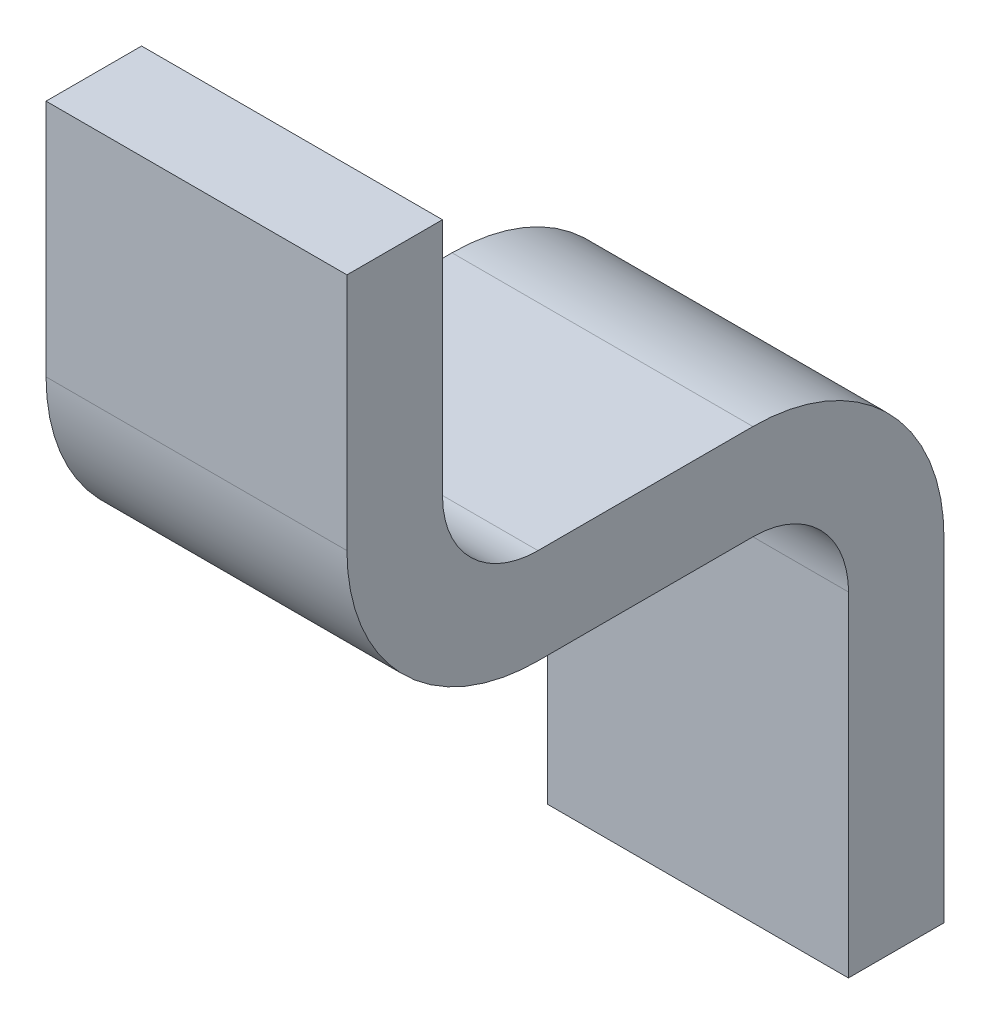
ISO-10303-21;
HEADER;
FILE_DESCRIPTION(('STEP AP214'),'2;1');
FILE_NAME('part.step','',(''),(''),'','','');
FILE_SCHEMA(('AUTOMOTIVE_DESIGN { 1 0 10303 214 1 1 1 1 }'));
ENDSEC;
DATA;
#1=APPLICATION_CONTEXT('core data for automotive mechanical design processes');
#2=APPLICATION_PROTOCOL_DEFINITION('international standard','automotive_design',2000,#1);
#3=PRODUCT_CONTEXT('',#1,'mechanical');
#4=PRODUCT('Part','Part','',(#3));
#5=PRODUCT_RELATED_PRODUCT_CATEGORY('part','',(#4));
#6=PRODUCT_DEFINITION_FORMATION('','',#4);
#7=PRODUCT_DEFINITION_CONTEXT('part definition',#1,'design');
#8=PRODUCT_DEFINITION('design','',#6,#7);
#9=PRODUCT_DEFINITION_SHAPE('','',#8);
#10=(LENGTH_UNIT() NAMED_UNIT(*) SI_UNIT(.MILLI.,.METRE.));
#11=(NAMED_UNIT(*) PLANE_ANGLE_UNIT() SI_UNIT($,.RADIAN.));
#12=(NAMED_UNIT(*) SI_UNIT($,.STERADIAN.) SOLID_ANGLE_UNIT());
#13=UNCERTAINTY_MEASURE_WITH_UNIT(LENGTH_MEASURE(1.E-05),#10,'distance_accuracy_value','');
#14=(GEOMETRIC_REPRESENTATION_CONTEXT(3) GLOBAL_UNCERTAINTY_ASSIGNED_CONTEXT((#13)) GLOBAL_UNIT_ASSIGNED_CONTEXT((#10,
#11,#12)) REPRESENTATION_CONTEXT('',''));
#15=CARTESIAN_POINT('',(0.,0.,0.));
#16=DIRECTION('',(0.,0.,1.));
#17=DIRECTION('',(1.,0.,0.));
#18=AXIS2_PLACEMENT_3D('',#15,#16,#17);
#19=CARTESIAN_POINT('',(-30.9980003715393,-4.22982485487725,2.68531594000001));
#20=CARTESIAN_POINT('',(-31.3760003715394,-4.22982487140016,2.68531594000001));
#21=CARTESIAN_POINT('',(-30.9980003715393,-4.22982485487725,2.56531594000001));
#22=CARTESIAN_POINT('',(-31.3760003715394,-4.22982487140016,2.56531594000001));
#23=(BOUNDED_SURFACE() B_SPLINE_SURFACE(1,1,((#19,#20),(#21,#22)),.UNSPECIFIED.,.F.,.F.,
.F.) B_SPLINE_SURFACE_WITH_KNOTS((2,2),(2,2),(-0.00011,1.E-05),(-0.000346500000000114,
3.15000000000103E-05),
.UNSPECIFIED.) GEOMETRIC_REPRESENTATION_ITEM() RATIONAL_B_SPLINE_SURFACE(((1.,1.),(1.,1.))) REPRESENTATION_ITEM('') SURFACE());
#24=CARTESIAN_POINT('',(-31.3445003715394,-4.22982487002325,2.57531594000001));
#25=CARTESIAN_POINT('',(-31.3445003715394,-4.22982487002325,2.67531594000001));
#26=(BOUNDED_CURVE() B_SPLINE_CURVE(1,(#24,#25),.UNSPECIFIED.,.F.,
.F.) B_SPLINE_CURVE_WITH_KNOTS((2,2),(-0.0001,0.),
.UNSPECIFIED.) CURVE() GEOMETRIC_REPRESENTATION_ITEM() RATIONAL_B_SPLINE_CURVE((1.,1.)) REPRESENTATION_ITEM(''));
#27=CARTESIAN_POINT('',(-31.3445003715394,-4.22982487002325,2.57531594000001));
#28=VERTEX_POINT('',#27);
#29=CARTESIAN_POINT('',(-31.3445003715394,-4.22982487002325,2.67531594000001));
#30=VERTEX_POINT('',#29);
#31=EDGE_CURVE('E181',#28,#30,#26,.T.);
#32=CARTESIAN_POINT('',(-31.3445003715394,-4.22982487002325,2.67531594000001));
#33=CARTESIAN_POINT('',(-31.0295003715393,-4.22982485625416,2.67531594000001));
#34=(BOUNDED_CURVE() B_SPLINE_CURVE(1,(#32,#33),.UNSPECIFIED.,.F.,
.F.) B_SPLINE_CURVE_WITH_KNOTS((2,2),(-0.000315000000000101,0.),
.UNSPECIFIED.) CURVE() GEOMETRIC_REPRESENTATION_ITEM() RATIONAL_B_SPLINE_CURVE((1.,1.)) REPRESENTATION_ITEM(''));
#35=CARTESIAN_POINT('',(-31.0295003715393,-4.22982485625416,2.67531594000001));
#36=VERTEX_POINT('',#35);
#37=EDGE_CURVE('E207',#30,#36,#34,.T.);
#38=CARTESIAN_POINT('',(-31.0295003715393,-4.22982485625416,2.67531594000001));
#39=CARTESIAN_POINT('',(-31.0295003715393,-4.22982485625416,2.57531594000001));
#40=(BOUNDED_CURVE() B_SPLINE_CURVE(1,(#38,#39),.UNSPECIFIED.,.F.,
.F.) B_SPLINE_CURVE_WITH_KNOTS((2,2),(-0.0001,0.),
.UNSPECIFIED.) CURVE() GEOMETRIC_REPRESENTATION_ITEM() RATIONAL_B_SPLINE_CURVE((1.,1.)) REPRESENTATION_ITEM(''));
#41=CARTESIAN_POINT('',(-31.0295003715393,-4.22982485625416,2.57531594000001));
#42=VERTEX_POINT('',#41);
#43=EDGE_CURVE('E249',#36,#42,#40,.T.);
#44=CARTESIAN_POINT('',(-31.0295003715393,-4.22982485625416,2.57531594000001));
#45=CARTESIAN_POINT('',(-31.3445003715394,-4.22982487002325,2.57531594000001));
#46=(BOUNDED_CURVE() B_SPLINE_CURVE(1,(#44,#45),.UNSPECIFIED.,.F.,
.F.) B_SPLINE_CURVE_WITH_KNOTS((2,2),(-0.000315000000000101,0.),
.UNSPECIFIED.) CURVE() GEOMETRIC_REPRESENTATION_ITEM() RATIONAL_B_SPLINE_CURVE((1.,1.)) REPRESENTATION_ITEM(''));
#47=EDGE_CURVE('E11',#42,#28,#46,.T.);
#48=ORIENTED_EDGE('',*,*,#31,.T.);
#49=ORIENTED_EDGE('',*,*,#37,.T.);
#50=ORIENTED_EDGE('',*,*,#43,.T.);
#51=ORIENTED_EDGE('',*,*,#47,.T.);
#52=EDGE_LOOP('',(#48,#49,#50,#51));
#53=FACE_BOUND('',#52,.T.);
#54=ADVANCED_FACE('F17',(#53),#23,.T.);
#55=CARTESIAN_POINT('',(-31.3760003726322,-4.20482487140015,2.57531594000001));
#56=CARTESIAN_POINT('',(-31.3760003595188,-4.50482487140017,2.57531594000001));
#57=CARTESIAN_POINT('',(-30.9980003726321,-4.20482485487725,2.57531594000001));
#58=CARTESIAN_POINT('',(-30.9980003595187,-4.50482485487727,2.57531594000001));
#59=(BOUNDED_SURFACE() B_SPLINE_SURFACE(1,1,((#55,#56),(#57,#58)),.UNSPECIFIED.,.F.,.F.,
.F.) B_SPLINE_SURFACE_WITH_KNOTS((2,2),(2,2),(-0.000346500000000112,3.15000000000177E-05),
(-2.50000000000049E-05,0.000275000000000012),
.UNSPECIFIED.) GEOMETRIC_REPRESENTATION_ITEM() RATIONAL_B_SPLINE_SURFACE(((1.,1.),(1.,1.))) REPRESENTATION_ITEM('') SURFACE());
#60=CARTESIAN_POINT('',(-31.0295003606115,-4.47982485625417,2.57531594000001));
#61=CARTESIAN_POINT('',(-31.3445003606115,-4.47982487002326,2.57531594000001));
#62=(BOUNDED_CURVE() B_SPLINE_CURVE(1,(#60,#61),.UNSPECIFIED.,.F.,
.F.) B_SPLINE_CURVE_WITH_KNOTS((2,2),(-0.000315,0.),
.UNSPECIFIED.) CURVE() GEOMETRIC_REPRESENTATION_ITEM() RATIONAL_B_SPLINE_CURVE((1.,1.)) REPRESENTATION_ITEM(''));
#63=CARTESIAN_POINT('',(-31.0295003606115,-4.47982485625416,2.57531594000001));
#64=VERTEX_POINT('',#63);
#65=CARTESIAN_POINT('',(-31.3445003606115,-4.47982487002326,2.57531594000001));
#66=VERTEX_POINT('',#65);
#67=EDGE_CURVE('E32',#64,#66,#62,.T.);
#68=CARTESIAN_POINT('',(-31.3445003715394,-4.22982487002325,2.57531594000001));
#69=CARTESIAN_POINT('',(-31.3445003606116,-4.47982487002326,2.57531594000001));
#70=(BOUNDED_CURVE() B_SPLINE_CURVE(1,(#68,#69),.UNSPECIFIED.,.F.,
.F.) B_SPLINE_CURVE_WITH_KNOTS((2,2),(0.,0.00025000000000001),
.UNSPECIFIED.) CURVE() GEOMETRIC_REPRESENTATION_ITEM() RATIONAL_B_SPLINE_CURVE((1.,1.)) REPRESENTATION_ITEM(''));
#71=EDGE_CURVE('E269',#28,#66,#70,.T.);
#72=CARTESIAN_POINT('',(-31.0295003715393,-4.22982485625416,2.57531594000001));
#73=CARTESIAN_POINT('',(-31.0295003606115,-4.47982485625416,2.57531594000001));
#74=(BOUNDED_CURVE() B_SPLINE_CURVE(1,(#72,#73),.UNSPECIFIED.,.F.,
.F.) B_SPLINE_CURVE_WITH_KNOTS((2,2),(0.,0.00025),
.UNSPECIFIED.) CURVE() GEOMETRIC_REPRESENTATION_ITEM() RATIONAL_B_SPLINE_CURVE((1.,1.)) REPRESENTATION_ITEM(''));
#75=EDGE_CURVE('E240',#42,#64,#74,.T.);
#76=ORIENTED_EDGE('',*,*,#67,.T.);
#77=ORIENTED_EDGE('',*,*,#71,.F.);
#78=ORIENTED_EDGE('',*,*,#47,.F.);
#79=ORIENTED_EDGE('',*,*,#75,.T.);
#80=EDGE_LOOP('',(#76,#77,#78,#79));
#81=FACE_BOUND('',#80,.T.);
#82=ADVANCED_FACE('F395',(#81),#59,.T.);
#83=CARTESIAN_POINT('',(-31.3445003606115,-4.47982487002326,2.57531594000001));
#84=CARTESIAN_POINT('',(-31.3445003562404,-4.57982487002326,2.57531594000001));
#85=CARTESIAN_POINT('',(-31.3445003562404,-4.57982487002326,2.47531594000001));
#86=CARTESIAN_POINT('',(-31.0295003606114,-4.47982485625417,2.57531594000001));
#87=CARTESIAN_POINT('',(-31.0295003562403,-4.57982485625417,2.57531594000001));
#88=CARTESIAN_POINT('',(-31.0295003562403,-4.57982485625417,2.47531594000001));
#89=(BOUNDED_SURFACE() B_SPLINE_SURFACE(1,2,((#83,#84,#85),(#86,#87,#88)),.UNSPECIFIED.,.F.,.F.,
.F.) B_SPLINE_SURFACE_WITH_KNOTS((2,2),(3,3),(-3.9778146934052E-13,3.15000000000066),
(-3.14159265358979,-1.5707963267949),
.UNSPECIFIED.) GEOMETRIC_REPRESENTATION_ITEM() RATIONAL_B_SPLINE_SURFACE(((1.,0.707106781186548,
1.),(1.,0.707106781186548,1.))) REPRESENTATION_ITEM('') SURFACE());
#90=CARTESIAN_POINT('',(-31.3445003562404,-4.57982487002324,2.47531594000001));
#91=CARTESIAN_POINT('',(-31.0295003562403,-4.57982485625415,2.47531594000001));
#92=(BOUNDED_CURVE() B_SPLINE_CURVE(1,(#90,#91),.UNSPECIFIED.,.F.,
.F.) B_SPLINE_CURVE_WITH_KNOTS((2,2),(0.,0.000315000000000105),
.UNSPECIFIED.) CURVE() GEOMETRIC_REPRESENTATION_ITEM() RATIONAL_B_SPLINE_CURVE((1.,1.)) REPRESENTATION_ITEM(''));
#93=CARTESIAN_POINT('',(-31.3445003562404,-4.57982487002324,2.47531594000001));
#94=VERTEX_POINT('',#93);
#95=CARTESIAN_POINT('',(-31.0295003562403,-4.57982485625416,2.47531594000001));
#96=VERTEX_POINT('',#95);
#97=EDGE_CURVE('E180',#94,#96,#92,.T.);
#98=CARTESIAN_POINT('',(-31.3445003606115,-4.47982487002326,2.57531594000001));
#99=CARTESIAN_POINT('',(-31.3445003562404,-4.57982487002326,2.57531594000001));
#100=CARTESIAN_POINT('',(-31.3445003562404,-4.57982487002326,2.47531594000001));
#101=(BOUNDED_CURVE() B_SPLINE_CURVE(2,(#98,#99,#100),.UNSPECIFIED.,.F.,
.F.) B_SPLINE_CURVE_WITH_KNOTS((3,3),(0.,1.5707963267949),
.UNSPECIFIED.) CURVE() GEOMETRIC_REPRESENTATION_ITEM() RATIONAL_B_SPLINE_CURVE((1.,
0.707106781186529,1.)) REPRESENTATION_ITEM(''));
#102=EDGE_CURVE('E259',#66,#94,#101,.T.);
#103=CARTESIAN_POINT('',(-31.0295003606115,-4.47982485625416,2.57531594000001));
#104=CARTESIAN_POINT('',(-31.0295003562404,-4.57982485625416,2.57531594000001));
#105=CARTESIAN_POINT('',(-31.0295003562404,-4.57982485625416,2.47531594000001));
#106=(BOUNDED_CURVE() B_SPLINE_CURVE(2,(#103,#104,#105),.UNSPECIFIED.,.F.,
.F.) B_SPLINE_CURVE_WITH_KNOTS((3,3),(-3.14159265358979,-1.5707963267949),
.UNSPECIFIED.) CURVE() GEOMETRIC_REPRESENTATION_ITEM() RATIONAL_B_SPLINE_CURVE((1.,
0.707106781186529,1.)) REPRESENTATION_ITEM(''));
#107=EDGE_CURVE('E250',#64,#96,#106,.T.);
#108=ORIENTED_EDGE('',*,*,#97,.F.);
#109=ORIENTED_EDGE('',*,*,#102,.F.);
#110=ORIENTED_EDGE('',*,*,#67,.F.);
#111=ORIENTED_EDGE('',*,*,#107,.T.);
#112=EDGE_LOOP('',(#108,#109,#110,#111));
#113=FACE_BOUND('',#112,.T.);
#114=ADVANCED_FACE('F389',(#113),#89,.T.);
#115=CARTESIAN_POINT('',(-31.3760003562404,-4.57982487140015,2.49781594000001));
#116=CARTESIAN_POINT('',(-31.3760003562404,-4.57982487140015,2.22781594000001));
#117=CARTESIAN_POINT('',(-30.9980003562403,-4.57982485487724,2.49781594000001));
#118=CARTESIAN_POINT('',(-30.9980003562403,-4.57982485487724,2.22781594000001));
#119=(BOUNDED_SURFACE() B_SPLINE_SURFACE(1,1,((#115,#116),(#117,#118)),.UNSPECIFIED.,.F.,.F.,
.F.) B_SPLINE_SURFACE_WITH_KNOTS((2,2),(2,2),(-0.000346500000000118,3.15000000000107E-05),
(-2.25E-05,0.0002475),
.UNSPECIFIED.) GEOMETRIC_REPRESENTATION_ITEM() RATIONAL_B_SPLINE_SURFACE(((1.,1.),(1.,1.))) REPRESENTATION_ITEM('') SURFACE());
#120=CARTESIAN_POINT('',(-31.0295003562403,-4.57982485625415,2.25031594000001));
#121=CARTESIAN_POINT('',(-31.3445003562404,-4.57982487002324,2.25031594000001));
#122=(BOUNDED_CURVE() B_SPLINE_CURVE(1,(#120,#121),.UNSPECIFIED.,.F.,
.F.) B_SPLINE_CURVE_WITH_KNOTS((2,2),(-0.000315000000000105,0.),
.UNSPECIFIED.) CURVE() GEOMETRIC_REPRESENTATION_ITEM() RATIONAL_B_SPLINE_CURVE((1.,1.)) REPRESENTATION_ITEM(''));
#123=CARTESIAN_POINT('',(-31.0295003562403,-4.57982485625416,2.25031594000001));
#124=VERTEX_POINT('',#123);
#125=CARTESIAN_POINT('',(-31.3445003562404,-4.57982487002324,2.25031594000001));
#126=VERTEX_POINT('',#125);
#127=EDGE_CURVE('E172',#124,#126,#122,.T.);
#128=CARTESIAN_POINT('',(-31.3445003562404,-4.57982487002324,2.47531594000001));
#129=CARTESIAN_POINT('',(-31.3445003562404,-4.57982487002324,2.25031594000001));
#130=(BOUNDED_CURVE() B_SPLINE_CURVE(1,(#128,#129),.UNSPECIFIED.,.F.,
.F.) B_SPLINE_CURVE_WITH_KNOTS((2,2),(0.0002,0.000425),
.UNSPECIFIED.) CURVE() GEOMETRIC_REPRESENTATION_ITEM() RATIONAL_B_SPLINE_CURVE((1.,1.)) REPRESENTATION_ITEM(''));
#131=EDGE_CURVE('E268',#94,#126,#130,.T.);
#132=CARTESIAN_POINT('',(-31.0295003562403,-4.57982485625416,2.47531594000001));
#133=CARTESIAN_POINT('',(-31.0295003562403,-4.57982485625416,2.25031594000001));
#134=(BOUNDED_CURVE() B_SPLINE_CURVE(1,(#132,#133),.UNSPECIFIED.,.F.,
.F.) B_SPLINE_CURVE_WITH_KNOTS((2,2),(0.,0.000225),
.UNSPECIFIED.) CURVE() GEOMETRIC_REPRESENTATION_ITEM() RATIONAL_B_SPLINE_CURVE((1.,1.)) REPRESENTATION_ITEM(''));
#135=EDGE_CURVE('E223',#96,#124,#134,.T.);
#136=ORIENTED_EDGE('',*,*,#127,.T.);
#137=ORIENTED_EDGE('',*,*,#131,.F.);
#138=ORIENTED_EDGE('',*,*,#97,.T.);
#139=ORIENTED_EDGE('',*,*,#135,.T.);
#140=EDGE_LOOP('',(#136,#137,#138,#139));
#141=FACE_BOUND('',#140,.T.);
#142=ADVANCED_FACE('F371',(#141),#119,.T.);
#143=CARTESIAN_POINT('',(-31.3445003562404,-4.57982487002325,2.25031594000001));
#144=CARTESIAN_POINT('',(-31.3445003562404,-4.57982487002325,2.05031594000001));
#145=CARTESIAN_POINT('',(-31.3445003474981,-4.77982487002325,2.05031594000001));
#146=CARTESIAN_POINT('',(-31.0295003562403,-4.57982485625416,2.25031594000001));
#147=CARTESIAN_POINT('',(-31.0295003562403,-4.57982485625416,2.05031594000001));
#148=CARTESIAN_POINT('',(-31.029500347498,-4.77982485625416,2.05031594000001));
#149=(BOUNDED_SURFACE() B_SPLINE_SURFACE(1,2,((#143,#144,#145),(#146,#147,#148)),.UNSPECIFIED.,
.F.,.F.,.F.) B_SPLINE_SURFACE_WITH_KNOTS((2,2),(3,3),(-1.57500000000039,1.35225164399344E-13),
(-1.5707963267949,0.),
.UNSPECIFIED.) GEOMETRIC_REPRESENTATION_ITEM() RATIONAL_B_SPLINE_SURFACE(((1.,0.707106781186534,
1.),(1.,0.707106781186534,1.))) REPRESENTATION_ITEM('') SURFACE());
#150=CARTESIAN_POINT('',(-31.0295003562404,-4.57982485625417,2.25031594000001));
#151=CARTESIAN_POINT('',(-31.0295003562404,-4.57982485625417,2.05031594000001));
#152=CARTESIAN_POINT('',(-31.0295003474981,-4.77982485625417,2.05031594000001));
#153=(BOUNDED_CURVE() B_SPLINE_CURVE(2,(#150,#151,#152),.UNSPECIFIED.,.F.,
.F.) B_SPLINE_CURVE_WITH_KNOTS((3,3),(-1.5707963267949,0.),
.UNSPECIFIED.) CURVE() GEOMETRIC_REPRESENTATION_ITEM() RATIONAL_B_SPLINE_CURVE((1.,
0.707106781186554,1.)) REPRESENTATION_ITEM(''));
#154=CARTESIAN_POINT('',(-31.0295003474981,-4.77982485625417,2.05031594000001));
#155=VERTEX_POINT('',#154);
#156=EDGE_CURVE('E205',#124,#155,#153,.T.);
#157=CARTESIAN_POINT('',(-31.0295003474981,-4.77982485625416,2.05031594000001));
#158=CARTESIAN_POINT('',(-31.3445003474981,-4.77982487002325,2.05031594000001));
#159=(BOUNDED_CURVE() B_SPLINE_CURVE(1,(#157,#158),.UNSPECIFIED.,.F.,
.F.) B_SPLINE_CURVE_WITH_KNOTS((2,2),(-0.000315,0.),
.UNSPECIFIED.) CURVE() GEOMETRIC_REPRESENTATION_ITEM() RATIONAL_B_SPLINE_CURVE((1.,1.)) REPRESENTATION_ITEM(''));
#160=CARTESIAN_POINT('',(-31.3445003474981,-4.77982487002325,2.05031594000001));
#161=VERTEX_POINT('',#160);
#162=EDGE_CURVE('E41',#155,#161,#159,.T.);
#163=CARTESIAN_POINT('',(-31.3445003562404,-4.57982487002325,2.25031594000001));
#164=CARTESIAN_POINT('',(-31.3445003562404,-4.57982487002325,2.05031594000001));
#165=CARTESIAN_POINT('',(-31.3445003474981,-4.77982487002325,2.05031594000001));
#166=(BOUNDED_CURVE() B_SPLINE_CURVE(2,(#163,#164,#165),.UNSPECIFIED.,.F.,
.F.) B_SPLINE_CURVE_WITH_KNOTS((3,3),(1.5707963267949,3.14159265358979),
.UNSPECIFIED.) CURVE() GEOMETRIC_REPRESENTATION_ITEM() RATIONAL_B_SPLINE_CURVE((1.,
0.707106781186554,1.)) REPRESENTATION_ITEM(''));
#167=EDGE_CURVE('E314',#126,#161,#166,.T.);
#168=ORIENTED_EDGE('',*,*,#156,.T.);
#169=ORIENTED_EDGE('',*,*,#162,.T.);
#170=ORIENTED_EDGE('',*,*,#167,.F.);
#171=ORIENTED_EDGE('',*,*,#127,.F.);
#172=EDGE_LOOP('',(#168,#169,#170,#171));
#173=FACE_BOUND('',#172,.T.);
#174=ADVANCED_FACE('F376',(#173),#149,.T.);
#175=CARTESIAN_POINT('',(-31.376000349028,-4.74482487140016,2.05031594000001));
#176=CARTESIAN_POINT('',(-31.3760003306693,-5.16482487140016,2.05031594000001));
#177=CARTESIAN_POINT('',(-30.998000349028,-4.74482485487725,2.05031594000001));
#178=CARTESIAN_POINT('',(-30.9980003306692,-5.16482485487726,2.05031594000001));
#179=(BOUNDED_SURFACE() B_SPLINE_SURFACE(1,1,((#175,#176),(#177,#178)),.UNSPECIFIED.,.F.,.F.,
.F.) B_SPLINE_SURFACE_WITH_KNOTS((2,2),(2,2),(-0.000346500000000022,3.15000000000474E-05),
(-3.50000000000005E-05,0.000385),
.UNSPECIFIED.) GEOMETRIC_REPRESENTATION_ITEM() RATIONAL_B_SPLINE_SURFACE(((1.,1.),(1.,1.))) REPRESENTATION_ITEM('') SURFACE());
#180=CARTESIAN_POINT('',(-31.0295003321991,-5.12982485625416,2.05031594000001));
#181=CARTESIAN_POINT('',(-31.3445003321991,-5.12982487002325,2.05031594000001));
#182=(BOUNDED_CURVE() B_SPLINE_CURVE(1,(#180,#181),.UNSPECIFIED.,.F.,
.F.) B_SPLINE_CURVE_WITH_KNOTS((2,2),(-0.000315,0.),
.UNSPECIFIED.) CURVE() GEOMETRIC_REPRESENTATION_ITEM() RATIONAL_B_SPLINE_CURVE((1.,1.)) REPRESENTATION_ITEM(''));
#183=CARTESIAN_POINT('',(-31.0295003321991,-5.12982485625416,2.05031594000001));
#184=VERTEX_POINT('',#183);
#185=CARTESIAN_POINT('',(-31.3445003321991,-5.12982487002325,2.05031594000001));
#186=VERTEX_POINT('',#185);
#187=EDGE_CURVE('E162',#184,#186,#182,.T.);
#188=CARTESIAN_POINT('',(-31.3445003474981,-4.77982487002325,2.05031594000001));
#189=CARTESIAN_POINT('',(-31.3445003321991,-5.12982487002325,2.05031594000001));
#190=(BOUNDED_CURVE() B_SPLINE_CURVE(1,(#188,#189),.UNSPECIFIED.,.F.,
.F.) B_SPLINE_CURVE_WITH_KNOTS((2,2),(0.00055,0.0009),
.UNSPECIFIED.) CURVE() GEOMETRIC_REPRESENTATION_ITEM() RATIONAL_B_SPLINE_CURVE((1.,1.)) REPRESENTATION_ITEM(''));
#191=EDGE_CURVE('E189',#161,#186,#190,.T.);
#192=CARTESIAN_POINT('',(-31.0295003474981,-4.77982485625417,2.05031594000001));
#193=CARTESIAN_POINT('',(-31.0295003321991,-5.12982485625416,2.05031594000001));
#194=(BOUNDED_CURVE() B_SPLINE_CURVE(1,(#192,#193),.UNSPECIFIED.,.F.,
.F.) B_SPLINE_CURVE_WITH_KNOTS((2,2),(0.,0.00034999999999999),
.UNSPECIFIED.) CURVE() GEOMETRIC_REPRESENTATION_ITEM() RATIONAL_B_SPLINE_CURVE((1.,1.)) REPRESENTATION_ITEM(''));
#195=EDGE_CURVE('E197',#155,#184,#194,.T.);
#196=ORIENTED_EDGE('',*,*,#187,.T.);
#197=ORIENTED_EDGE('',*,*,#191,.F.);
#198=ORIENTED_EDGE('',*,*,#162,.F.);
#199=ORIENTED_EDGE('',*,*,#195,.T.);
#200=EDGE_LOOP('',(#196,#197,#198,#199));
#201=FACE_BOUND('',#200,.T.);
#202=ADVANCED_FACE('F379',(#201),#179,.T.);
#203=CARTESIAN_POINT('',(-31.3445003754734,-4.13982487002325,2.73781594000001));
#204=CARTESIAN_POINT('',(-31.3445003282651,-5.21982487002325,2.73781594000001));
#205=CARTESIAN_POINT('',(-31.3445003754734,-4.13982487002325,1.98781594000001));
#206=CARTESIAN_POINT('',(-31.3445003282651,-5.21982487002325,1.98781594000001));
#207=(BOUNDED_SURFACE() B_SPLINE_SURFACE(1,1,((#203,#204),(#205,#206)),.UNSPECIFIED.,.F.,.F.,
.F.) B_SPLINE_SURFACE_WITH_KNOTS((2,2),(2,2),(-0.0006875,6.25E-05),(-9.E-05,0.00099),
.UNSPECIFIED.) GEOMETRIC_REPRESENTATION_ITEM() RATIONAL_B_SPLINE_SURFACE(((1.,1.),(1.,1.))) REPRESENTATION_ITEM('') SURFACE());
#208=CARTESIAN_POINT('',(-31.3445003321991,-5.12982487002325,2.05031594000001));
#209=CARTESIAN_POINT('',(-31.3445003321991,-5.12982487002325,2.15031594000001));
#210=(BOUNDED_CURVE() B_SPLINE_CURVE(1,(#208,#209),.UNSPECIFIED.,.F.,
.F.) B_SPLINE_CURVE_WITH_KNOTS((2,2),(-0.000625,-0.000525),
.UNSPECIFIED.) CURVE() GEOMETRIC_REPRESENTATION_ITEM() RATIONAL_B_SPLINE_CURVE((1.,1.)) REPRESENTATION_ITEM(''));
#211=CARTESIAN_POINT('',(-31.3445003321991,-5.12982487002325,2.15031594000001));
#212=VERTEX_POINT('',#211);
#213=EDGE_CURVE('E163',#186,#212,#210,.T.);
#214=CARTESIAN_POINT('',(-31.3445003474981,-4.77982487002325,2.15031594000001));
#215=CARTESIAN_POINT('',(-31.3445003321991,-5.12982487002325,2.15031594000001));
#216=(BOUNDED_CURVE() B_SPLINE_CURVE(1,(#214,#215),.UNSPECIFIED.,.F.,
.F.) B_SPLINE_CURVE_WITH_KNOTS((2,2),(0.,0.00035),
.UNSPECIFIED.) CURVE() GEOMETRIC_REPRESENTATION_ITEM() RATIONAL_B_SPLINE_CURVE((1.,1.)) REPRESENTATION_ITEM(''));
#217=CARTESIAN_POINT('',(-31.3445003474981,-4.77982487002325,2.15031594000001));
#218=VERTEX_POINT('',#217);
#219=EDGE_CURVE('E132',#218,#212,#216,.T.);
#220=CARTESIAN_POINT('',(-31.3445003518692,-4.67982487002325,2.25031594000001));
#221=CARTESIAN_POINT('',(-31.3445003518692,-4.67982487002325,2.15031594000001));
#222=CARTESIAN_POINT('',(-31.3445003474981,-4.77982487002325,2.15031594000001));
#223=(BOUNDED_CURVE() B_SPLINE_CURVE(2,(#220,#221,#222),.UNSPECIFIED.,.F.,
.F.) B_SPLINE_CURVE_WITH_KNOTS((3,3),(1.5707963267949,3.14159265358979),
.UNSPECIFIED.) CURVE() GEOMETRIC_REPRESENTATION_ITEM() RATIONAL_B_SPLINE_CURVE((1.,
0.707106781186537,1.)) REPRESENTATION_ITEM(''));
#224=CARTESIAN_POINT('',(-31.3445003518693,-4.67982487002325,2.25031594000001));
#225=VERTEX_POINT('',#224);
#226=EDGE_CURVE('E23',#225,#218,#223,.T.);
#227=CARTESIAN_POINT('',(-31.3445003518693,-4.67982487002325,2.47531594000001));
#228=CARTESIAN_POINT('',(-31.3445003518693,-4.67982487002325,2.25031594000001));
#229=(BOUNDED_CURVE() B_SPLINE_CURVE(1,(#227,#228),.UNSPECIFIED.,.F.,
.F.) B_SPLINE_CURVE_WITH_KNOTS((2,2),(0.,0.000225),
.UNSPECIFIED.) CURVE() GEOMETRIC_REPRESENTATION_ITEM() RATIONAL_B_SPLINE_CURVE((1.,1.)) REPRESENTATION_ITEM(''));
#230=CARTESIAN_POINT('',(-31.3445003518693,-4.67982487002325,2.47531594000001));
#231=VERTEX_POINT('',#230);
#232=EDGE_CURVE('E121',#231,#225,#229,.T.);
#233=CARTESIAN_POINT('',(-31.3445003606115,-4.47982487002326,2.67531594000001));
#234=CARTESIAN_POINT('',(-31.3445003518692,-4.67982487002326,2.67531594000001));
#235=CARTESIAN_POINT('',(-31.3445003518692,-4.67982487002326,2.47531594000001));
#236=(BOUNDED_CURVE() B_SPLINE_CURVE(2,(#233,#234,#235),.UNSPECIFIED.,.F.,
.F.) B_SPLINE_CURVE_WITH_KNOTS((3,3),(0.,1.5707963267949),
.UNSPECIFIED.) CURVE() GEOMETRIC_REPRESENTATION_ITEM() RATIONAL_B_SPLINE_CURVE((1.,
0.707106781186551,1.)) REPRESENTATION_ITEM(''));
#237=CARTESIAN_POINT('',(-31.3445003606115,-4.47982487002326,2.67531594000001));
#238=VERTEX_POINT('',#237);
#239=EDGE_CURVE('E117',#238,#231,#236,.T.);
#240=CARTESIAN_POINT('',(-31.3445003715394,-4.22982487002325,2.67531594000001));
#241=CARTESIAN_POINT('',(-31.3445003606116,-4.47982487002326,2.67531594000001));
#242=(BOUNDED_CURVE() B_SPLINE_CURVE(1,(#240,#241),.UNSPECIFIED.,.F.,
.F.) B_SPLINE_CURVE_WITH_KNOTS((2,2),(0.,0.00025000000000001),
.UNSPECIFIED.) CURVE() GEOMETRIC_REPRESENTATION_ITEM() RATIONAL_B_SPLINE_CURVE((1.,1.)) REPRESENTATION_ITEM(''));
#243=EDGE_CURVE('E215',#30,#238,#242,.T.);
#244=ORIENTED_EDGE('',*,*,#71,.T.);
#245=ORIENTED_EDGE('',*,*,#102,.T.);
#246=ORIENTED_EDGE('',*,*,#131,.T.);
#247=ORIENTED_EDGE('',*,*,#167,.T.);
#248=ORIENTED_EDGE('',*,*,#191,.T.);
#249=ORIENTED_EDGE('',*,*,#213,.T.);
#250=ORIENTED_EDGE('',*,*,#219,.F.);
#251=ORIENTED_EDGE('',*,*,#226,.F.);
#252=ORIENTED_EDGE('',*,*,#232,.F.);
#253=ORIENTED_EDGE('',*,*,#239,.F.);
#254=ORIENTED_EDGE('',*,*,#243,.F.);
#255=ORIENTED_EDGE('',*,*,#31,.F.);
#256=EDGE_LOOP('',(#244,#245,#246,#247,#248,#249,#250,#251,#252,#253,#254,#255));
#257=FACE_BOUND('',#256,.T.);
#258=ADVANCED_FACE('F130',(#257),#207,.T.);
#259=CARTESIAN_POINT('',(-30.9980003606114,-4.20482485350034,2.67531594000001));
#260=CARTESIAN_POINT('',(-30.998000347498,-4.50482487002326,2.67531594000001));
#261=CARTESIAN_POINT('',(-31.376000373725,-4.20482487002325,2.67531594000001));
#262=CARTESIAN_POINT('',(-31.3760003606116,-4.50482488654617,2.67531594000001));
#263=(BOUNDED_SURFACE() B_SPLINE_SURFACE(1,1,((#259,#260),(#261,#262)),.UNSPECIFIED.,.F.,.F.,
.F.) B_SPLINE_SURFACE_WITH_KNOTS((2,2),(2,2),(-0.000346500001092897,3.15000120206364E-05),
(-2.50000013769102E-05,0.000275000015146011),
.UNSPECIFIED.) GEOMETRIC_REPRESENTATION_ITEM() RATIONAL_B_SPLINE_SURFACE(((1.,1.),(1.,1.))) REPRESENTATION_ITEM('') SURFACE());
#264=CARTESIAN_POINT('',(-31.3445003606115,-4.47982487002325,2.67531594000001));
#265=CARTESIAN_POINT('',(-31.0295003606115,-4.47982485625416,2.67531594000001));
#266=(BOUNDED_CURVE() B_SPLINE_CURVE(1,(#264,#265),.UNSPECIFIED.,.F.,
.F.) B_SPLINE_CURVE_WITH_KNOTS((2,2),(-0.000315,0.),
.UNSPECIFIED.) CURVE() GEOMETRIC_REPRESENTATION_ITEM() RATIONAL_B_SPLINE_CURVE((1.,1.)) REPRESENTATION_ITEM(''));
#267=CARTESIAN_POINT('',(-31.0295003606115,-4.47982485625416,2.67531594000001));
#268=VERTEX_POINT('',#267);
#269=EDGE_CURVE('E149',#238,#268,#266,.T.);
#270=CARTESIAN_POINT('',(-31.0295003715393,-4.22982485625416,2.67531594000001));
#271=CARTESIAN_POINT('',(-31.0295003606115,-4.47982485625416,2.67531594000001));
#272=(BOUNDED_CURVE() B_SPLINE_CURVE(1,(#270,#271),.UNSPECIFIED.,.F.,
.F.) B_SPLINE_CURVE_WITH_KNOTS((2,2),(0.,0.00025),
.UNSPECIFIED.) CURVE() GEOMETRIC_REPRESENTATION_ITEM() RATIONAL_B_SPLINE_CURVE((1.,1.)) REPRESENTATION_ITEM(''));
#273=EDGE_CURVE('E171',#36,#268,#272,.T.);
#274=ORIENTED_EDGE('',*,*,#269,.T.);
#275=ORIENTED_EDGE('',*,*,#273,.F.);
#276=ORIENTED_EDGE('',*,*,#37,.F.);
#277=ORIENTED_EDGE('',*,*,#243,.T.);
#278=EDGE_LOOP('',(#274,#275,#276,#277));
#279=FACE_BOUND('',#278,.T.);
#280=ADVANCED_FACE('F19',(#279),#263,.T.);
#281=CARTESIAN_POINT('',(-31.0295003606115,-4.47982485625416,2.67531594000001));
#282=CARTESIAN_POINT('',(-31.0295003518692,-4.67982485625416,2.67531594000001));
#283=CARTESIAN_POINT('',(-31.0295003518692,-4.67982485625416,2.47531594000001));
#284=CARTESIAN_POINT('',(-31.3445003606116,-4.47982487002325,2.67531594000001));
#285=CARTESIAN_POINT('',(-31.3445003518693,-4.67982487002325,2.67531594000001));
#286=CARTESIAN_POINT('',(-31.3445003518693,-4.67982487002325,2.47531594000001));
#287=(BOUNDED_SURFACE() B_SPLINE_SURFACE(1,2,((#281,#282,#283),(#284,#285,#286)),.UNSPECIFIED.,
.F.,.F.,.F.) B_SPLINE_SURFACE_WITH_KNOTS((2,2),(3,3),(-1.57500000000039,1.13020703906841E-13),
(-3.14159265358979,-1.5707963267949),
.UNSPECIFIED.) GEOMETRIC_REPRESENTATION_ITEM() RATIONAL_B_SPLINE_SURFACE(((1.,0.707106781186548,
1.),(1.,0.707106781186548,1.))) REPRESENTATION_ITEM('') SURFACE());
#288=CARTESIAN_POINT('',(-31.3445003518693,-4.67982487002325,2.47531594000001));
#289=CARTESIAN_POINT('',(-31.0295003518692,-4.67982485625416,2.47531594000001));
#290=(BOUNDED_CURVE() B_SPLINE_CURVE(1,(#288,#289),.UNSPECIFIED.,.F.,
.F.) B_SPLINE_CURVE_WITH_KNOTS((2,2),(-0.000315000000000101,0.),
.UNSPECIFIED.) CURVE() GEOMETRIC_REPRESENTATION_ITEM() RATIONAL_B_SPLINE_CURVE((1.,1.)) REPRESENTATION_ITEM(''));
#291=CARTESIAN_POINT('',(-31.0295003518692,-4.67982485625416,2.47531594000001));
#292=VERTEX_POINT('',#291);
#293=EDGE_CURVE('E124',#231,#292,#290,.T.);
#294=CARTESIAN_POINT('',(-31.0295003606115,-4.47982485625416,2.67531594000001));
#295=CARTESIAN_POINT('',(-31.0295003518692,-4.67982485625416,2.67531594000001));
#296=CARTESIAN_POINT('',(-31.0295003518692,-4.67982485625416,2.47531594000001));
#297=(BOUNDED_CURVE() B_SPLINE_CURVE(2,(#294,#295,#296),.UNSPECIFIED.,.F.,
.F.) B_SPLINE_CURVE_WITH_KNOTS((3,3),(-3.14159265358979,-1.5707963267949),
.UNSPECIFIED.) CURVE() GEOMETRIC_REPRESENTATION_ITEM() RATIONAL_B_SPLINE_CURVE((1.,
0.707106781186551,1.)) REPRESENTATION_ITEM(''));
#298=EDGE_CURVE('E239',#268,#292,#297,.T.);
#299=ORIENTED_EDGE('',*,*,#239,.T.);
#300=ORIENTED_EDGE('',*,*,#293,.T.);
#301=ORIENTED_EDGE('',*,*,#298,.F.);
#302=ORIENTED_EDGE('',*,*,#269,.F.);
#303=EDGE_LOOP('',(#299,#300,#301,#302));
#304=FACE_BOUND('',#303,.T.);
#305=ADVANCED_FACE('F426',(#304),#287,.T.);
#306=CARTESIAN_POINT('',(-30.9980003518692,-4.67982485487725,2.49781594000001));
#307=CARTESIAN_POINT('',(-30.9980003518692,-4.67982485487725,2.22781594000001));
#308=CARTESIAN_POINT('',(-31.3760003518693,-4.67982487140016,2.49781594000001));
#309=CARTESIAN_POINT('',(-31.3760003518693,-4.67982487140016,2.22781594000001));
#310=(BOUNDED_SURFACE() B_SPLINE_SURFACE(1,1,((#306,#307),(#308,#309)),.UNSPECIFIED.,.F.,.F.,
.F.) B_SPLINE_SURFACE_WITH_KNOTS((2,2),(2,2),(-0.000346500000000118,3.15000000000107E-05),
(-2.25E-05,0.0002475),
.UNSPECIFIED.) GEOMETRIC_REPRESENTATION_ITEM() RATIONAL_B_SPLINE_SURFACE(((1.,1.),(1.,1.))) REPRESENTATION_ITEM('') SURFACE());
#311=CARTESIAN_POINT('',(-31.3445003518693,-4.67982487002325,2.25031594000001));
#312=CARTESIAN_POINT('',(-31.0295003518692,-4.67982485625416,2.25031594000001));
#313=(BOUNDED_CURVE() B_SPLINE_CURVE(1,(#311,#312),.UNSPECIFIED.,.F.,
.F.) B_SPLINE_CURVE_WITH_KNOTS((2,2),(-0.000315000000000101,0.),
.UNSPECIFIED.) CURVE() GEOMETRIC_REPRESENTATION_ITEM() RATIONAL_B_SPLINE_CURVE((1.,1.)) REPRESENTATION_ITEM(''));
#314=CARTESIAN_POINT('',(-31.0295003518692,-4.67982485625416,2.25031594000001));
#315=VERTEX_POINT('',#314);
#316=EDGE_CURVE('E85',#225,#315,#313,.T.);
#317=CARTESIAN_POINT('',(-31.0295003518692,-4.67982485625416,2.47531594000001));
#318=CARTESIAN_POINT('',(-31.0295003518692,-4.67982485625416,2.25031594000001));
#319=(BOUNDED_CURVE() B_SPLINE_CURVE(1,(#317,#318),.UNSPECIFIED.,.F.,
.F.) B_SPLINE_CURVE_WITH_KNOTS((2,2),(0.0001,0.000325),
.UNSPECIFIED.) CURVE() GEOMETRIC_REPRESENTATION_ITEM() RATIONAL_B_SPLINE_CURVE((1.,1.)) REPRESENTATION_ITEM(''));
#320=EDGE_CURVE('E315',#292,#315,#319,.T.);
#321=ORIENTED_EDGE('',*,*,#316,.T.);
#322=ORIENTED_EDGE('',*,*,#320,.F.);
#323=ORIENTED_EDGE('',*,*,#293,.F.);
#324=ORIENTED_EDGE('',*,*,#232,.T.);
#325=EDGE_LOOP('',(#321,#322,#323,#324));
#326=FACE_BOUND('',#325,.T.);
#327=ADVANCED_FACE('F123',(#326),#310,.T.);
#328=CARTESIAN_POINT('',(-31.0295003518692,-4.67982485625417,2.25031594000001));
#329=CARTESIAN_POINT('',(-31.0295003518692,-4.67982485625417,2.15031594000001));
#330=CARTESIAN_POINT('',(-31.0295003474981,-4.77982485625417,2.15031594000001));
#331=CARTESIAN_POINT('',(-31.3445003518693,-4.67982487002326,2.25031594000001));
#332=CARTESIAN_POINT('',(-31.3445003518693,-4.67982487002326,2.15031594000001));
#333=CARTESIAN_POINT('',(-31.3445003474982,-4.77982487002326,2.15031594000001));
#334=(BOUNDED_SURFACE() B_SPLINE_SURFACE(1,2,((#328,#329,#330),(#331,#332,#333)),.UNSPECIFIED.,
.F.,.F.,.F.) B_SPLINE_SURFACE_WITH_KNOTS((2,2),(3,3),(-3.97781473466084E-13,3.15000000000061),
(-1.5707963267949,0.),
.UNSPECIFIED.) GEOMETRIC_REPRESENTATION_ITEM() RATIONAL_B_SPLINE_SURFACE(((1.,0.707106781186547,
1.),(1.,0.707106781186547,1.))) REPRESENTATION_ITEM('') SURFACE());
#335=CARTESIAN_POINT('',(-31.0295003474981,-4.77982485625417,2.15031594000001));
#336=CARTESIAN_POINT('',(-31.3445003474981,-4.77982487002326,2.15031594000001));
#337=(BOUNDED_CURVE() B_SPLINE_CURVE(1,(#335,#336),.UNSPECIFIED.,.F.,
.F.) B_SPLINE_CURVE_WITH_KNOTS((2,2),(0.,0.000315),
.UNSPECIFIED.) CURVE() GEOMETRIC_REPRESENTATION_ITEM() RATIONAL_B_SPLINE_CURVE((1.,1.)) REPRESENTATION_ITEM(''));
#338=CARTESIAN_POINT('',(-31.0295003474981,-4.77982485625417,2.15031594000001));
#339=VERTEX_POINT('',#338);
#340=EDGE_CURVE('E76',#339,#218,#337,.T.);
#341=CARTESIAN_POINT('',(-31.0295003518692,-4.67982485625417,2.25031594000001));
#342=CARTESIAN_POINT('',(-31.0295003518692,-4.67982485625417,2.15031594000001));
#343=CARTESIAN_POINT('',(-31.0295003474981,-4.77982485625417,2.15031594000001));
#344=(BOUNDED_CURVE() B_SPLINE_CURVE(2,(#341,#342,#343),.UNSPECIFIED.,.F.,
.F.) B_SPLINE_CURVE_WITH_KNOTS((3,3),(-1.5707963267949,0.),
.UNSPECIFIED.) CURVE() GEOMETRIC_REPRESENTATION_ITEM() RATIONAL_B_SPLINE_CURVE((1.,
0.707106781186537,1.)) REPRESENTATION_ITEM(''));
#345=EDGE_CURVE('E136',#315,#339,#344,.T.);
#346=ORIENTED_EDGE('',*,*,#340,.F.);
#347=ORIENTED_EDGE('',*,*,#345,.F.);
#348=ORIENTED_EDGE('',*,*,#316,.F.);
#349=ORIENTED_EDGE('',*,*,#226,.T.);
#350=EDGE_LOOP('',(#346,#347,#348,#349));
#351=FACE_BOUND('',#350,.T.);
#352=ADVANCED_FACE('F134',(#351),#334,.T.);
#353=CARTESIAN_POINT('',(-30.998000332199,-4.74482485350034,2.15031594000001));
#354=CARTESIAN_POINT('',(-30.9980003138403,-5.16482487002325,2.15031594000001));
#355=CARTESIAN_POINT('',(-31.3760003505579,-4.74482487002325,2.15031594000001));
#356=CARTESIAN_POINT('',(-31.3760003321991,-5.16482488654616,2.15031594000001));
#357=(BOUNDED_SURFACE() B_SPLINE_SURFACE(1,1,((#353,#354),(#355,#356)),.UNSPECIFIED.,.F.,.F.,
.F.) B_SPLINE_SURFACE_WITH_KNOTS((2,2),(2,2),(-0.000346500001529908,3.15000168289554E-05),
(-3.50000013769164E-05,0.00038500001514599),
.UNSPECIFIED.) GEOMETRIC_REPRESENTATION_ITEM() RATIONAL_B_SPLINE_SURFACE(((1.,1.),(1.,1.))) REPRESENTATION_ITEM('') SURFACE());
#358=CARTESIAN_POINT('',(-31.3445003321991,-5.12982487002325,2.15031594000001));
#359=CARTESIAN_POINT('',(-31.0295003321991,-5.12982485625416,2.15031594000001));
#360=(BOUNDED_CURVE() B_SPLINE_CURVE(1,(#358,#359),.UNSPECIFIED.,.F.,
.F.) B_SPLINE_CURVE_WITH_KNOTS((2,2),(-0.000315,0.),
.UNSPECIFIED.) CURVE() GEOMETRIC_REPRESENTATION_ITEM() RATIONAL_B_SPLINE_CURVE((1.,1.)) REPRESENTATION_ITEM(''));
#361=CARTESIAN_POINT('',(-31.0295003321991,-5.12982485625416,2.15031594000001));
#362=VERTEX_POINT('',#361);
#363=EDGE_CURVE('E161',#212,#362,#360,.T.);
#364=CARTESIAN_POINT('',(-31.029500347498,-4.77982485625417,2.15031594000001));
#365=CARTESIAN_POINT('',(-31.029500332199,-5.12982485625416,2.15031594000001));
#366=(BOUNDED_CURVE() B_SPLINE_CURVE(1,(#364,#365),.UNSPECIFIED.,.F.,
.F.) B_SPLINE_CURVE_WITH_KNOTS((2,2),(0.00055000000000001,0.0009),
.UNSPECIFIED.) CURVE() GEOMETRIC_REPRESENTATION_ITEM() RATIONAL_B_SPLINE_CURVE((1.,1.)) REPRESENTATION_ITEM(''));
#367=EDGE_CURVE('E206',#339,#362,#366,.T.);
#368=ORIENTED_EDGE('',*,*,#363,.T.);
#369=ORIENTED_EDGE('',*,*,#367,.F.);
#370=ORIENTED_EDGE('',*,*,#340,.T.);
#371=ORIENTED_EDGE('',*,*,#219,.T.);
#372=EDGE_LOOP('',(#368,#369,#370,#371));
#373=FACE_BOUND('',#372,.T.);
#374=ADVANCED_FACE('F520',(#373),#357,.T.);
#375=CARTESIAN_POINT('',(-31.0295003754733,-4.13982485625416,1.98781594000001));
#376=CARTESIAN_POINT('',(-31.029500328265,-5.21982485625416,1.98781594000001));
#377=CARTESIAN_POINT('',(-31.0295003754733,-4.13982485625416,2.73781594000001));
#378=CARTESIAN_POINT('',(-31.029500328265,-5.21982485625416,2.73781594000001));
#379=(BOUNDED_SURFACE() B_SPLINE_SURFACE(1,1,((#375,#376),(#377,#378)),.UNSPECIFIED.,.F.,.F.,
.F.) B_SPLINE_SURFACE_WITH_KNOTS((2,2),(2,2),(-0.0001625,0.0005875),(-9.E-05,0.00099),
.UNSPECIFIED.) GEOMETRIC_REPRESENTATION_ITEM() RATIONAL_B_SPLINE_SURFACE(((1.,1.),(1.,1.))) REPRESENTATION_ITEM('') SURFACE());
#380=CARTESIAN_POINT('',(-31.0295003321991,-5.12982485625416,2.15031594000001));
#381=CARTESIAN_POINT('',(-31.0295003321991,-5.12982485625416,2.05031594000001));
#382=(BOUNDED_CURVE() B_SPLINE_CURVE(1,(#380,#381),.UNSPECIFIED.,.F.,
.F.) B_SPLINE_CURVE_WITH_KNOTS((2,2),(0.000425,0.000525),
.UNSPECIFIED.) CURVE() GEOMETRIC_REPRESENTATION_ITEM() RATIONAL_B_SPLINE_CURVE((1.,1.)) REPRESENTATION_ITEM(''));
#383=EDGE_CURVE('E152',#362,#184,#382,.T.);
#384=ORIENTED_EDGE('',*,*,#273,.T.);
#385=ORIENTED_EDGE('',*,*,#298,.T.);
#386=ORIENTED_EDGE('',*,*,#320,.T.);
#387=ORIENTED_EDGE('',*,*,#345,.T.);
#388=ORIENTED_EDGE('',*,*,#367,.T.);
#389=ORIENTED_EDGE('',*,*,#383,.T.);
#390=ORIENTED_EDGE('',*,*,#195,.F.);
#391=ORIENTED_EDGE('',*,*,#156,.F.);
#392=ORIENTED_EDGE('',*,*,#135,.F.);
#393=ORIENTED_EDGE('',*,*,#107,.F.);
#394=ORIENTED_EDGE('',*,*,#75,.F.);
#395=ORIENTED_EDGE('',*,*,#43,.F.);
#396=EDGE_LOOP('',(#384,#385,#386,#387,#388,#389,#390,#391,#392,#393,#394,#395));
#397=FACE_BOUND('',#396,.T.);
#398=ADVANCED_FACE('F460',(#397),#379,.T.);
#399=CARTESIAN_POINT('',(-30.9980003321991,-5.12982485487726,2.04031594000001));
#400=CARTESIAN_POINT('',(-31.3760003321991,-5.12982487140016,2.04031594000001));
#401=CARTESIAN_POINT('',(-30.9980003321991,-5.12982485487726,2.16031594000001));
#402=CARTESIAN_POINT('',(-31.3760003321991,-5.12982487140016,2.16031594000001));
#403=(BOUNDED_SURFACE() B_SPLINE_SURFACE(1,1,((#399,#400),(#401,#402)),.UNSPECIFIED.,.F.,.F.,
.F.) B_SPLINE_SURFACE_WITH_KNOTS((2,2),(2,2),(-0.00011,1.E-05),(-0.0003465,3.15E-05),
.UNSPECIFIED.) GEOMETRIC_REPRESENTATION_ITEM() RATIONAL_B_SPLINE_SURFACE(((1.,1.),(1.,1.))) REPRESENTATION_ITEM('') SURFACE());
#404=ORIENTED_EDGE('',*,*,#187,.F.);
#405=ORIENTED_EDGE('',*,*,#383,.F.);
#406=ORIENTED_EDGE('',*,*,#363,.F.);
#407=ORIENTED_EDGE('',*,*,#213,.F.);
#408=EDGE_LOOP('',(#404,#405,#406,#407));
#409=FACE_BOUND('',#408,.T.);
#410=ADVANCED_FACE('F518',(#409),#403,.T.);
#411=CLOSED_SHELL('',(#54,#82,#114,#142,#174,#202,#258,#280,#305,#327,#352,#374,#398,#410));
#412=MANIFOLD_SOLID_BREP('B1',#411);
#413=ADVANCED_BREP_SHAPE_REPRESENTATION('',(#18,#412),#14);
#414=SHAPE_DEFINITION_REPRESENTATION(#9,#413);
ENDSEC;
END-ISO-10303-21;
